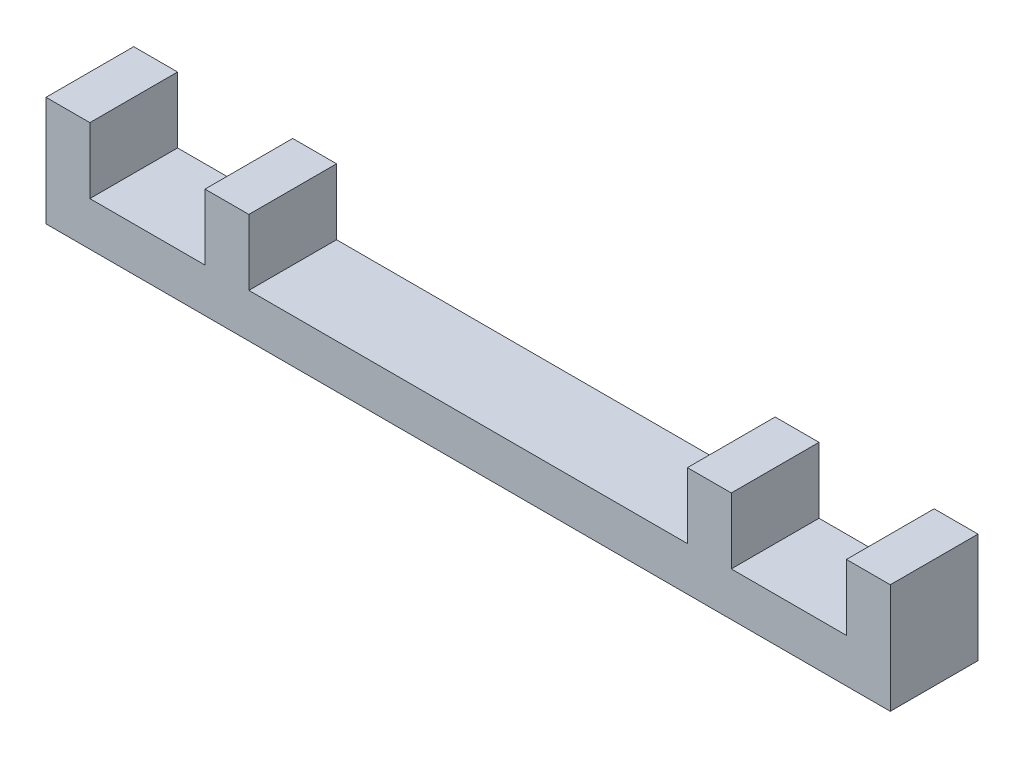
ISO-10303-21;
HEADER;
FILE_DESCRIPTION(('STEP AP214'),'2;1');
FILE_NAME('part.step','',(''),(''),'','','');
FILE_SCHEMA(('AUTOMOTIVE_DESIGN { 1 0 10303 214 1 1 1 1 }'));
ENDSEC;
DATA;
#1=APPLICATION_CONTEXT('core data for automotive mechanical design processes');
#2=APPLICATION_PROTOCOL_DEFINITION('international standard','automotive_design',2000,#1);
#3=PRODUCT_CONTEXT('',#1,'mechanical');
#4=PRODUCT('Part','Part','',(#3));
#5=PRODUCT_RELATED_PRODUCT_CATEGORY('part','',(#4));
#6=PRODUCT_DEFINITION_FORMATION('','',#4);
#7=PRODUCT_DEFINITION_CONTEXT('part definition',#1,'design');
#8=PRODUCT_DEFINITION('design','',#6,#7);
#9=PRODUCT_DEFINITION_SHAPE('','',#8);
#10=(LENGTH_UNIT() NAMED_UNIT(*) SI_UNIT(.MILLI.,.METRE.));
#11=(NAMED_UNIT(*) PLANE_ANGLE_UNIT() SI_UNIT($,.RADIAN.));
#12=(NAMED_UNIT(*) SI_UNIT($,.STERADIAN.) SOLID_ANGLE_UNIT());
#13=UNCERTAINTY_MEASURE_WITH_UNIT(LENGTH_MEASURE(1.E-05),#10,'distance_accuracy_value','');
#14=(GEOMETRIC_REPRESENTATION_CONTEXT(3) GLOBAL_UNCERTAINTY_ASSIGNED_CONTEXT((#13)) GLOBAL_UNIT_ASSIGNED_CONTEXT((#10,
#11,#12)) REPRESENTATION_CONTEXT('',''));
#15=CARTESIAN_POINT('',(0.,0.,0.));
#16=DIRECTION('',(0.,0.,1.));
#17=DIRECTION('',(1.,0.,0.));
#18=AXIS2_PLACEMENT_3D('',#15,#16,#17);
#19=CARTESIAN_POINT('',(0.,0.,8.));
#20=DIRECTION('',(0.,-1.,0.));
#21=DIRECTION('',(1.,0.,0.));
#22=AXIS2_PLACEMENT_3D('',#19,#20,#21);
#23=PLANE('',#22);
#24=DIRECTION('',(-1.,0.,0.));
#25=VECTOR('',#24,1.);
#26=CARTESIAN_POINT('',(0.,0.,0.));
#27=LINE('',#26,#25);
#28=CARTESIAN_POINT('',(20.,0.,0.));
#29=VERTEX_POINT('',#28);
#30=CARTESIAN_POINT('',(-20.,0.,0.));
#31=VERTEX_POINT('',#30);
#32=EDGE_CURVE('E154',#29,#31,#27,.T.);
#33=ORIENTED_EDGE('',*,*,#32,.T.);
#34=DIRECTION('',(0.,0.,-1.));
#35=VECTOR('',#34,1.);
#36=CARTESIAN_POINT('',(-20.,0.,8.));
#37=LINE('',#36,#35);
#38=CARTESIAN_POINT('',(-20.,0.,8.));
#39=VERTEX_POINT('',#38);
#40=EDGE_CURVE('E11',#39,#31,#37,.T.);
#41=ORIENTED_EDGE('',*,*,#40,.F.);
#42=DIRECTION('',(-1.,0.,0.));
#43=VECTOR('',#42,1.);
#44=CARTESIAN_POINT('',(0.,0.,8.));
#45=LINE('',#44,#43);
#46=CARTESIAN_POINT('',(20.,0.,8.));
#47=VERTEX_POINT('',#46);
#48=EDGE_CURVE('E106',#47,#39,#45,.T.);
#49=ORIENTED_EDGE('',*,*,#48,.F.);
#50=DIRECTION('',(0.,0.,-1.));
#51=VECTOR('',#50,1.);
#52=CARTESIAN_POINT('',(20.,0.,8.));
#53=LINE('',#52,#51);
#54=EDGE_CURVE('E158',#47,#29,#53,.T.);
#55=ORIENTED_EDGE('',*,*,#54,.T.);
#56=EDGE_LOOP('',(#33,#41,#49,#55));
#57=FACE_BOUND('',#56,.T.);
#58=ADVANCED_FACE('F45',(#57),#23,.F.);
#59=CARTESIAN_POINT('',(-20.,0.,8.));
#60=DIRECTION('',(-1.,0.,0.));
#61=DIRECTION('',(0.,0.,1.));
#62=AXIS2_PLACEMENT_3D('',#59,#60,#61);
#63=PLANE('',#62);
#64=DIRECTION('',(0.,1.,0.));
#65=VECTOR('',#64,1.);
#66=CARTESIAN_POINT('',(-20.,0.,0.));
#67=LINE('',#66,#65);
#68=CARTESIAN_POINT('',(-20.,6.,0.));
#69=VERTEX_POINT('',#68);
#70=EDGE_CURVE('E157',#31,#69,#67,.T.);
#71=ORIENTED_EDGE('',*,*,#70,.T.);
#72=DIRECTION('',(0.,0.,-1.));
#73=VECTOR('',#72,1.);
#74=CARTESIAN_POINT('',(-20.,6.,8.));
#75=LINE('',#74,#73);
#76=CARTESIAN_POINT('',(-20.,6.,8.));
#77=VERTEX_POINT('',#76);
#78=EDGE_CURVE('E54',#77,#69,#75,.T.);
#79=ORIENTED_EDGE('',*,*,#78,.F.);
#80=DIRECTION('',(0.,1.,0.));
#81=VECTOR('',#80,1.);
#82=CARTESIAN_POINT('',(-20.,0.,8.));
#83=LINE('',#82,#81);
#84=EDGE_CURVE('E223',#39,#77,#83,.T.);
#85=ORIENTED_EDGE('',*,*,#84,.F.);
#86=ORIENTED_EDGE('',*,*,#40,.T.);
#87=EDGE_LOOP('',(#71,#79,#85,#86));
#88=FACE_BOUND('',#87,.T.);
#89=ADVANCED_FACE('F389',(#88),#63,.F.);
#90=CARTESIAN_POINT('',(-20.,6.,8.));
#91=DIRECTION('',(0.,-1.,0.));
#92=DIRECTION('',(1.,0.,0.));
#93=AXIS2_PLACEMENT_3D('',#90,#91,#92);
#94=PLANE('',#93);
#95=DIRECTION('',(-1.,0.,0.));
#96=VECTOR('',#95,1.);
#97=CARTESIAN_POINT('',(-20.,6.,0.));
#98=LINE('',#97,#96);
#99=CARTESIAN_POINT('',(-24.,6.,0.));
#100=VERTEX_POINT('',#99);
#101=EDGE_CURVE('E161',#69,#100,#98,.T.);
#102=ORIENTED_EDGE('',*,*,#101,.T.);
#103=DIRECTION('',(0.,0.,-1.));
#104=VECTOR('',#103,1.);
#105=CARTESIAN_POINT('',(-24.,6.,8.));
#106=LINE('',#105,#104);
#107=CARTESIAN_POINT('',(-24.,6.,8.));
#108=VERTEX_POINT('',#107);
#109=EDGE_CURVE('E190',#108,#100,#106,.T.);
#110=ORIENTED_EDGE('',*,*,#109,.F.);
#111=DIRECTION('',(-1.,0.,0.));
#112=VECTOR('',#111,1.);
#113=CARTESIAN_POINT('',(-20.,6.,8.));
#114=LINE('',#113,#112);
#115=EDGE_CURVE('E201',#77,#108,#114,.T.);
#116=ORIENTED_EDGE('',*,*,#115,.F.);
#117=ORIENTED_EDGE('',*,*,#78,.T.);
#118=EDGE_LOOP('',(#102,#110,#116,#117));
#119=FACE_BOUND('',#118,.T.);
#120=ADVANCED_FACE('F199',(#119),#94,.F.);
#121=CARTESIAN_POINT('',(-24.,6.,8.));
#122=DIRECTION('',(1.,0.,0.));
#123=DIRECTION('',(0.,0.,-1.));
#124=AXIS2_PLACEMENT_3D('',#121,#122,#123);
#125=PLANE('',#124);
#126=DIRECTION('',(0.,-1.,0.));
#127=VECTOR('',#126,1.);
#128=CARTESIAN_POINT('',(-24.,6.,0.));
#129=LINE('',#128,#127);
#130=CARTESIAN_POINT('',(-24.,0.,0.));
#131=VERTEX_POINT('',#130);
#132=EDGE_CURVE('E164',#100,#131,#129,.T.);
#133=ORIENTED_EDGE('',*,*,#132,.T.);
#134=DIRECTION('',(0.,0.,-1.));
#135=VECTOR('',#134,1.);
#136=CARTESIAN_POINT('',(-24.,0.,8.));
#137=LINE('',#136,#135);
#138=CARTESIAN_POINT('',(-24.,0.,8.));
#139=VERTEX_POINT('',#138);
#140=EDGE_CURVE('E186',#139,#131,#137,.T.);
#141=ORIENTED_EDGE('',*,*,#140,.F.);
#142=DIRECTION('',(0.,-1.,0.));
#143=VECTOR('',#142,1.);
#144=CARTESIAN_POINT('',(-24.,6.,8.));
#145=LINE('',#144,#143);
#146=EDGE_CURVE('E217',#108,#139,#145,.T.);
#147=ORIENTED_EDGE('',*,*,#146,.F.);
#148=ORIENTED_EDGE('',*,*,#109,.T.);
#149=EDGE_LOOP('',(#133,#141,#147,#148));
#150=FACE_BOUND('',#149,.T.);
#151=ADVANCED_FACE('F212',(#150),#125,.F.);
#152=CARTESIAN_POINT('',(-24.,0.,8.));
#153=DIRECTION('',(0.,-1.,0.));
#154=DIRECTION('',(1.,0.,0.));
#155=AXIS2_PLACEMENT_3D('',#152,#153,#154);
#156=PLANE('',#155);
#157=DIRECTION('',(-1.,0.,0.));
#158=VECTOR('',#157,1.);
#159=CARTESIAN_POINT('',(-24.,0.,0.));
#160=LINE('',#159,#158);
#161=CARTESIAN_POINT('',(-34.5,0.,0.));
#162=VERTEX_POINT('',#161);
#163=EDGE_CURVE('E167',#131,#162,#160,.T.);
#164=ORIENTED_EDGE('',*,*,#163,.T.);
#165=DIRECTION('',(0.,0.,-1.));
#166=VECTOR('',#165,1.);
#167=CARTESIAN_POINT('',(-34.5,0.,8.));
#168=LINE('',#167,#166);
#169=CARTESIAN_POINT('',(-34.5,0.,8.));
#170=VERTEX_POINT('',#169);
#171=EDGE_CURVE('E140',#170,#162,#168,.T.);
#172=ORIENTED_EDGE('',*,*,#171,.F.);
#173=DIRECTION('',(-1.,0.,0.));
#174=VECTOR('',#173,1.);
#175=CARTESIAN_POINT('',(-24.,0.,8.));
#176=LINE('',#175,#174);
#177=EDGE_CURVE('E129',#139,#170,#176,.T.);
#178=ORIENTED_EDGE('',*,*,#177,.F.);
#179=ORIENTED_EDGE('',*,*,#140,.T.);
#180=EDGE_LOOP('',(#164,#172,#178,#179));
#181=FACE_BOUND('',#180,.T.);
#182=ADVANCED_FACE('F215',(#181),#156,.F.);
#183=CARTESIAN_POINT('',(-34.5,0.,8.));
#184=DIRECTION('',(-1.,0.,0.));
#185=DIRECTION('',(0.,0.,1.));
#186=AXIS2_PLACEMENT_3D('',#183,#184,#185);
#187=PLANE('',#186);
#188=DIRECTION('',(0.,1.,0.));
#189=VECTOR('',#188,1.);
#190=CARTESIAN_POINT('',(-34.5,0.,0.));
#191=LINE('',#190,#189);
#192=CARTESIAN_POINT('',(-34.5,6.,0.));
#193=VERTEX_POINT('',#192);
#194=EDGE_CURVE('E138',#162,#193,#191,.T.);
#195=ORIENTED_EDGE('',*,*,#194,.T.);
#196=DIRECTION('',(0.,0.,-1.));
#197=VECTOR('',#196,1.);
#198=CARTESIAN_POINT('',(-34.5,6.,8.));
#199=LINE('',#198,#197);
#200=CARTESIAN_POINT('',(-34.5,6.,8.));
#201=VERTEX_POINT('',#200);
#202=EDGE_CURVE('E135',#201,#193,#199,.T.);
#203=ORIENTED_EDGE('',*,*,#202,.F.);
#204=DIRECTION('',(0.,1.,0.));
#205=VECTOR('',#204,1.);
#206=CARTESIAN_POINT('',(-34.5,0.,8.));
#207=LINE('',#206,#205);
#208=EDGE_CURVE('E123',#170,#201,#207,.T.);
#209=ORIENTED_EDGE('',*,*,#208,.F.);
#210=ORIENTED_EDGE('',*,*,#171,.T.);
#211=EDGE_LOOP('',(#195,#203,#209,#210));
#212=FACE_BOUND('',#211,.T.);
#213=ADVANCED_FACE('F136',(#212),#187,.F.);
#214=CARTESIAN_POINT('',(-34.5,6.,8.));
#215=DIRECTION('',(0.,-1.,0.));
#216=DIRECTION('',(1.,0.,0.));
#217=AXIS2_PLACEMENT_3D('',#214,#215,#216);
#218=PLANE('',#217);
#219=DIRECTION('',(-1.,0.,0.));
#220=VECTOR('',#219,1.);
#221=CARTESIAN_POINT('',(-34.5,6.,0.));
#222=LINE('',#221,#220);
#223=CARTESIAN_POINT('',(-38.5,6.,0.));
#224=VERTEX_POINT('',#223);
#225=EDGE_CURVE('E92',#193,#224,#222,.T.);
#226=ORIENTED_EDGE('',*,*,#225,.T.);
#227=DIRECTION('',(0.,0.,-1.));
#228=VECTOR('',#227,1.);
#229=CARTESIAN_POINT('',(-38.5,6.,8.));
#230=LINE('',#229,#228);
#231=CARTESIAN_POINT('',(-38.5,6.,8.));
#232=VERTEX_POINT('',#231);
#233=EDGE_CURVE('E141',#232,#224,#230,.T.);
#234=ORIENTED_EDGE('',*,*,#233,.F.);
#235=DIRECTION('',(-1.,0.,0.));
#236=VECTOR('',#235,1.);
#237=CARTESIAN_POINT('',(-34.5,6.,8.));
#238=LINE('',#237,#236);
#239=EDGE_CURVE('E127',#201,#232,#238,.T.);
#240=ORIENTED_EDGE('',*,*,#239,.F.);
#241=ORIENTED_EDGE('',*,*,#202,.T.);
#242=EDGE_LOOP('',(#226,#234,#240,#241));
#243=FACE_BOUND('',#242,.T.);
#244=ADVANCED_FACE('F143',(#243),#218,.F.);
#245=CARTESIAN_POINT('',(-38.5,6.,8.));
#246=DIRECTION('',(1.,0.,0.));
#247=DIRECTION('',(0.,0.,-1.));
#248=AXIS2_PLACEMENT_3D('',#245,#246,#247);
#249=PLANE('',#248);
#250=DIRECTION('',(0.,-1.,0.));
#251=VECTOR('',#250,1.);
#252=CARTESIAN_POINT('',(-38.5,6.,0.));
#253=LINE('',#252,#251);
#254=CARTESIAN_POINT('',(-38.5,-4.,0.));
#255=VERTEX_POINT('',#254);
#256=EDGE_CURVE('E98',#224,#255,#253,.T.);
#257=ORIENTED_EDGE('',*,*,#256,.T.);
#258=DIRECTION('',(0.,0.,-1.));
#259=VECTOR('',#258,1.);
#260=CARTESIAN_POINT('',(-38.5,-4.,8.));
#261=LINE('',#260,#259);
#262=CARTESIAN_POINT('',(-38.5,-4.,8.));
#263=VERTEX_POINT('',#262);
#264=EDGE_CURVE('E153',#263,#255,#261,.T.);
#265=ORIENTED_EDGE('',*,*,#264,.F.);
#266=DIRECTION('',(0.,-1.,0.));
#267=VECTOR('',#266,1.);
#268=CARTESIAN_POINT('',(-38.5,6.,8.));
#269=LINE('',#268,#267);
#270=EDGE_CURVE('E62',#232,#263,#269,.T.);
#271=ORIENTED_EDGE('',*,*,#270,.F.);
#272=ORIENTED_EDGE('',*,*,#233,.T.);
#273=EDGE_LOOP('',(#257,#265,#271,#272));
#274=FACE_BOUND('',#273,.T.);
#275=ADVANCED_FACE('F378',(#274),#249,.F.);
#276=CARTESIAN_POINT('',(-38.5,-4.,8.));
#277=DIRECTION('',(0.,1.,0.));
#278=DIRECTION('',(0.,0.,1.));
#279=AXIS2_PLACEMENT_3D('',#276,#277,#278);
#280=PLANE('',#279);
#281=DIRECTION('',(1.,0.,0.));
#282=VECTOR('',#281,1.);
#283=CARTESIAN_POINT('',(-38.5,-4.,0.));
#284=LINE('',#283,#282);
#285=CARTESIAN_POINT('',(38.5,-4.,0.));
#286=VERTEX_POINT('',#285);
#287=EDGE_CURVE('E176',#255,#286,#284,.T.);
#288=ORIENTED_EDGE('',*,*,#287,.T.);
#289=DIRECTION('',(0.,0.,-1.));
#290=VECTOR('',#289,1.);
#291=CARTESIAN_POINT('',(38.5,-4.,8.));
#292=LINE('',#291,#290);
#293=CARTESIAN_POINT('',(38.5,-4.,8.));
#294=VERTEX_POINT('',#293);
#295=EDGE_CURVE('E255',#294,#286,#292,.T.);
#296=ORIENTED_EDGE('',*,*,#295,.F.);
#297=DIRECTION('',(1.,0.,0.));
#298=VECTOR('',#297,1.);
#299=CARTESIAN_POINT('',(-38.5,-4.,8.));
#300=LINE('',#299,#298);
#301=EDGE_CURVE('E147',#263,#294,#300,.T.);
#302=ORIENTED_EDGE('',*,*,#301,.F.);
#303=ORIENTED_EDGE('',*,*,#264,.T.);
#304=EDGE_LOOP('',(#288,#296,#302,#303));
#305=FACE_BOUND('',#304,.T.);
#306=ADVANCED_FACE('F377',(#305),#280,.F.);
#307=CARTESIAN_POINT('',(0.,0.,8.));
#308=DIRECTION('',(0.,0.,1.));
#309=DIRECTION('',(1.,0.,0.));
#310=AXIS2_PLACEMENT_3D('',#307,#308,#309);
#311=PLANE('',#310);
#312=ORIENTED_EDGE('',*,*,#301,.T.);
#313=DIRECTION('',(0.,-1.,0.));
#314=VECTOR('',#313,1.);
#315=CARTESIAN_POINT('',(38.5,6.,8.));
#316=LINE('',#315,#314);
#317=CARTESIAN_POINT('',(38.5,6.,8.));
#318=VERTEX_POINT('',#317);
#319=EDGE_CURVE('E259',#318,#294,#316,.T.);
#320=ORIENTED_EDGE('',*,*,#319,.F.);
#321=DIRECTION('',(1.,0.,0.));
#322=VECTOR('',#321,1.);
#323=CARTESIAN_POINT('',(34.5,6.,8.));
#324=LINE('',#323,#322);
#325=CARTESIAN_POINT('',(34.5,6.,8.));
#326=VERTEX_POINT('',#325);
#327=EDGE_CURVE('E292',#326,#318,#324,.T.);
#328=ORIENTED_EDGE('',*,*,#327,.F.);
#329=DIRECTION('',(0.,1.,0.));
#330=VECTOR('',#329,1.);
#331=CARTESIAN_POINT('',(34.5,0.,8.));
#332=LINE('',#331,#330);
#333=CARTESIAN_POINT('',(34.5,0.,8.));
#334=VERTEX_POINT('',#333);
#335=EDGE_CURVE('E296',#334,#326,#332,.T.);
#336=ORIENTED_EDGE('',*,*,#335,.F.);
#337=DIRECTION('',(1.,0.,0.));
#338=VECTOR('',#337,1.);
#339=CARTESIAN_POINT('',(24.,0.,8.));
#340=LINE('',#339,#338);
#341=CARTESIAN_POINT('',(24.,0.,8.));
#342=VERTEX_POINT('',#341);
#343=EDGE_CURVE('E300',#342,#334,#340,.T.);
#344=ORIENTED_EDGE('',*,*,#343,.F.);
#345=DIRECTION('',(0.,-1.,0.));
#346=VECTOR('',#345,1.);
#347=CARTESIAN_POINT('',(24.,6.,8.));
#348=LINE('',#347,#346);
#349=CARTESIAN_POINT('',(24.,6.,8.));
#350=VERTEX_POINT('',#349);
#351=EDGE_CURVE('E304',#350,#342,#348,.T.);
#352=ORIENTED_EDGE('',*,*,#351,.F.);
#353=DIRECTION('',(1.,0.,0.));
#354=VECTOR('',#353,1.);
#355=CARTESIAN_POINT('',(20.,6.,8.));
#356=LINE('',#355,#354);
#357=CARTESIAN_POINT('',(20.,6.,8.));
#358=VERTEX_POINT('',#357);
#359=EDGE_CURVE('E308',#358,#350,#356,.T.);
#360=ORIENTED_EDGE('',*,*,#359,.F.);
#361=DIRECTION('',(0.,1.,0.));
#362=VECTOR('',#361,1.);
#363=CARTESIAN_POINT('',(20.,0.,8.));
#364=LINE('',#363,#362);
#365=EDGE_CURVE('E264',#47,#358,#364,.T.);
#366=ORIENTED_EDGE('',*,*,#365,.F.);
#367=ORIENTED_EDGE('',*,*,#48,.T.);
#368=ORIENTED_EDGE('',*,*,#84,.T.);
#369=ORIENTED_EDGE('',*,*,#115,.T.);
#370=ORIENTED_EDGE('',*,*,#146,.T.);
#371=ORIENTED_EDGE('',*,*,#177,.T.);
#372=ORIENTED_EDGE('',*,*,#208,.T.);
#373=ORIENTED_EDGE('',*,*,#239,.T.);
#374=ORIENTED_EDGE('',*,*,#270,.T.);
#375=EDGE_LOOP('',(#312,#320,#328,#336,#344,#352,#360,#366,#367,#368,#369,#370,#371,#372,#373,#374));
#376=FACE_BOUND('',#375,.T.);
#377=ADVANCED_FACE('F125',(#376),#311,.T.);
#378=CARTESIAN_POINT('',(0.,0.,0.));
#379=DIRECTION('',(0.,0.,1.));
#380=DIRECTION('',(1.,0.,0.));
#381=AXIS2_PLACEMENT_3D('',#378,#379,#380);
#382=PLANE('',#381);
#383=ORIENTED_EDGE('',*,*,#32,.F.);
#384=DIRECTION('',(0.,1.,0.));
#385=VECTOR('',#384,1.);
#386=CARTESIAN_POINT('',(20.,0.,0.));
#387=LINE('',#386,#385);
#388=CARTESIAN_POINT('',(20.,6.,0.));
#389=VERTEX_POINT('',#388);
#390=EDGE_CURVE('E285',#29,#389,#387,.T.);
#391=ORIENTED_EDGE('',*,*,#390,.T.);
#392=DIRECTION('',(1.,0.,0.));
#393=VECTOR('',#392,1.);
#394=CARTESIAN_POINT('',(20.,6.,0.));
#395=LINE('',#394,#393);
#396=CARTESIAN_POINT('',(24.,6.,0.));
#397=VERTEX_POINT('',#396);
#398=EDGE_CURVE('E281',#389,#397,#395,.T.);
#399=ORIENTED_EDGE('',*,*,#398,.T.);
#400=DIRECTION('',(0.,-1.,0.));
#401=VECTOR('',#400,1.);
#402=CARTESIAN_POINT('',(24.,6.,0.));
#403=LINE('',#402,#401);
#404=CARTESIAN_POINT('',(24.,0.,0.));
#405=VERTEX_POINT('',#404);
#406=EDGE_CURVE('E277',#397,#405,#403,.T.);
#407=ORIENTED_EDGE('',*,*,#406,.T.);
#408=DIRECTION('',(1.,0.,0.));
#409=VECTOR('',#408,1.);
#410=CARTESIAN_POINT('',(24.,0.,0.));
#411=LINE('',#410,#409);
#412=CARTESIAN_POINT('',(34.5,0.,0.));
#413=VERTEX_POINT('',#412);
#414=EDGE_CURVE('E273',#405,#413,#411,.T.);
#415=ORIENTED_EDGE('',*,*,#414,.T.);
#416=DIRECTION('',(0.,1.,0.));
#417=VECTOR('',#416,1.);
#418=CARTESIAN_POINT('',(34.5,0.,0.));
#419=LINE('',#418,#417);
#420=CARTESIAN_POINT('',(34.5,6.,0.));
#421=VERTEX_POINT('',#420);
#422=EDGE_CURVE('E269',#413,#421,#419,.T.);
#423=ORIENTED_EDGE('',*,*,#422,.T.);
#424=DIRECTION('',(1.,0.,0.));
#425=VECTOR('',#424,1.);
#426=CARTESIAN_POINT('',(34.5,6.,0.));
#427=LINE('',#426,#425);
#428=CARTESIAN_POINT('',(38.5,6.,0.));
#429=VERTEX_POINT('',#428);
#430=EDGE_CURVE('E265',#421,#429,#427,.T.);
#431=ORIENTED_EDGE('',*,*,#430,.T.);
#432=DIRECTION('',(0.,-1.,0.));
#433=VECTOR('',#432,1.);
#434=CARTESIAN_POINT('',(38.5,6.,0.));
#435=LINE('',#434,#433);
#436=EDGE_CURVE('E260',#429,#286,#435,.T.);
#437=ORIENTED_EDGE('',*,*,#436,.T.);
#438=ORIENTED_EDGE('',*,*,#287,.F.);
#439=ORIENTED_EDGE('',*,*,#256,.F.);
#440=ORIENTED_EDGE('',*,*,#225,.F.);
#441=ORIENTED_EDGE('',*,*,#194,.F.);
#442=ORIENTED_EDGE('',*,*,#163,.F.);
#443=ORIENTED_EDGE('',*,*,#132,.F.);
#444=ORIENTED_EDGE('',*,*,#101,.F.);
#445=ORIENTED_EDGE('',*,*,#70,.F.);
#446=EDGE_LOOP('',(#383,#391,#399,#407,#415,#423,#431,#437,#438,#439,#440,#441,#442,#443,#444,#445));
#447=FACE_BOUND('',#446,.T.);
#448=ADVANCED_FACE('F208',(#447),#382,.F.);
#449=CARTESIAN_POINT('',(20.,0.,8.));
#450=DIRECTION('',(1.,0.,0.));
#451=DIRECTION('',(0.,0.,1.));
#452=AXIS2_PLACEMENT_3D('',#449,#450,#451);
#453=PLANE('',#452);
#454=ORIENTED_EDGE('',*,*,#390,.F.);
#455=ORIENTED_EDGE('',*,*,#54,.F.);
#456=ORIENTED_EDGE('',*,*,#365,.T.);
#457=DIRECTION('',(0.,0.,-1.));
#458=VECTOR('',#457,1.);
#459=CARTESIAN_POINT('',(20.,6.,8.));
#460=LINE('',#459,#458);
#461=EDGE_CURVE('E231',#358,#389,#460,.T.);
#462=ORIENTED_EDGE('',*,*,#461,.T.);
#463=EDGE_LOOP('',(#454,#455,#456,#462));
#464=FACE_BOUND('',#463,.T.);
#465=ADVANCED_FACE('F318',(#464),#453,.F.);
#466=CARTESIAN_POINT('',(20.,6.,8.));
#467=DIRECTION('',(0.,-1.,0.));
#468=DIRECTION('',(-1.,0.,0.));
#469=AXIS2_PLACEMENT_3D('',#466,#467,#468);
#470=PLANE('',#469);
#471=ORIENTED_EDGE('',*,*,#398,.F.);
#472=ORIENTED_EDGE('',*,*,#461,.F.);
#473=ORIENTED_EDGE('',*,*,#359,.T.);
#474=DIRECTION('',(0.,0.,-1.));
#475=VECTOR('',#474,1.);
#476=CARTESIAN_POINT('',(24.,6.,8.));
#477=LINE('',#476,#475);
#478=EDGE_CURVE('E235',#350,#397,#477,.T.);
#479=ORIENTED_EDGE('',*,*,#478,.T.);
#480=EDGE_LOOP('',(#471,#472,#473,#479));
#481=FACE_BOUND('',#480,.T.);
#482=ADVANCED_FACE('F395',(#481),#470,.F.);
#483=CARTESIAN_POINT('',(24.,6.,8.));
#484=DIRECTION('',(-1.,0.,0.));
#485=DIRECTION('',(0.,0.,-1.));
#486=AXIS2_PLACEMENT_3D('',#483,#484,#485);
#487=PLANE('',#486);
#488=ORIENTED_EDGE('',*,*,#406,.F.);
#489=ORIENTED_EDGE('',*,*,#478,.F.);
#490=ORIENTED_EDGE('',*,*,#351,.T.);
#491=DIRECTION('',(0.,0.,-1.));
#492=VECTOR('',#491,1.);
#493=CARTESIAN_POINT('',(24.,0.,8.));
#494=LINE('',#493,#492);
#495=EDGE_CURVE('E239',#342,#405,#494,.T.);
#496=ORIENTED_EDGE('',*,*,#495,.T.);
#497=EDGE_LOOP('',(#488,#489,#490,#496));
#498=FACE_BOUND('',#497,.T.);
#499=ADVANCED_FACE('F397',(#498),#487,.F.);
#500=CARTESIAN_POINT('',(24.,0.,8.));
#501=DIRECTION('',(0.,-1.,0.));
#502=DIRECTION('',(-1.,0.,0.));
#503=AXIS2_PLACEMENT_3D('',#500,#501,#502);
#504=PLANE('',#503);
#505=ORIENTED_EDGE('',*,*,#414,.F.);
#506=ORIENTED_EDGE('',*,*,#495,.F.);
#507=ORIENTED_EDGE('',*,*,#343,.T.);
#508=DIRECTION('',(0.,0.,-1.));
#509=VECTOR('',#508,1.);
#510=CARTESIAN_POINT('',(34.5,0.,8.));
#511=LINE('',#510,#509);
#512=EDGE_CURVE('E243',#334,#413,#511,.T.);
#513=ORIENTED_EDGE('',*,*,#512,.T.);
#514=EDGE_LOOP('',(#505,#506,#507,#513));
#515=FACE_BOUND('',#514,.T.);
#516=ADVANCED_FACE('F372',(#515),#504,.F.);
#517=CARTESIAN_POINT('',(34.5,0.,8.));
#518=DIRECTION('',(1.,0.,0.));
#519=DIRECTION('',(0.,0.,1.));
#520=AXIS2_PLACEMENT_3D('',#517,#518,#519);
#521=PLANE('',#520);
#522=ORIENTED_EDGE('',*,*,#422,.F.);
#523=ORIENTED_EDGE('',*,*,#512,.F.);
#524=ORIENTED_EDGE('',*,*,#335,.T.);
#525=DIRECTION('',(0.,0.,-1.));
#526=VECTOR('',#525,1.);
#527=CARTESIAN_POINT('',(34.5,6.,8.));
#528=LINE('',#527,#526);
#529=EDGE_CURVE('E247',#326,#421,#528,.T.);
#530=ORIENTED_EDGE('',*,*,#529,.T.);
#531=EDGE_LOOP('',(#522,#523,#524,#530));
#532=FACE_BOUND('',#531,.T.);
#533=ADVANCED_FACE('F370',(#532),#521,.F.);
#534=CARTESIAN_POINT('',(34.5,6.,8.));
#535=DIRECTION('',(0.,-1.,0.));
#536=DIRECTION('',(-1.,0.,0.));
#537=AXIS2_PLACEMENT_3D('',#534,#535,#536);
#538=PLANE('',#537);
#539=ORIENTED_EDGE('',*,*,#430,.F.);
#540=ORIENTED_EDGE('',*,*,#529,.F.);
#541=ORIENTED_EDGE('',*,*,#327,.T.);
#542=DIRECTION('',(0.,0.,-1.));
#543=VECTOR('',#542,1.);
#544=CARTESIAN_POINT('',(38.5,6.,8.));
#545=LINE('',#544,#543);
#546=EDGE_CURVE('E251',#318,#429,#545,.T.);
#547=ORIENTED_EDGE('',*,*,#546,.T.);
#548=EDGE_LOOP('',(#539,#540,#541,#547));
#549=FACE_BOUND('',#548,.T.);
#550=ADVANCED_FACE('F366',(#549),#538,.F.);
#551=CARTESIAN_POINT('',(38.5,6.,8.));
#552=DIRECTION('',(-1.,0.,0.));
#553=DIRECTION('',(0.,0.,-1.));
#554=AXIS2_PLACEMENT_3D('',#551,#552,#553);
#555=PLANE('',#554);
#556=ORIENTED_EDGE('',*,*,#436,.F.);
#557=ORIENTED_EDGE('',*,*,#546,.F.);
#558=ORIENTED_EDGE('',*,*,#319,.T.);
#559=ORIENTED_EDGE('',*,*,#295,.T.);
#560=EDGE_LOOP('',(#556,#557,#558,#559));
#561=FACE_BOUND('',#560,.T.);
#562=ADVANCED_FACE('F362',(#561),#555,.F.);
#563=CLOSED_SHELL('',(#58,#89,#120,#151,#182,#213,#244,#275,#306,#377,#448,#465,#482,#499,#516,
#533,#550,#562));
#564=MANIFOLD_SOLID_BREP('B2',#563);
#565=ADVANCED_BREP_SHAPE_REPRESENTATION('',(#18,#564),#14);
#566=SHAPE_DEFINITION_REPRESENTATION(#9,#565);
ENDSEC;
END-ISO-10303-21;
